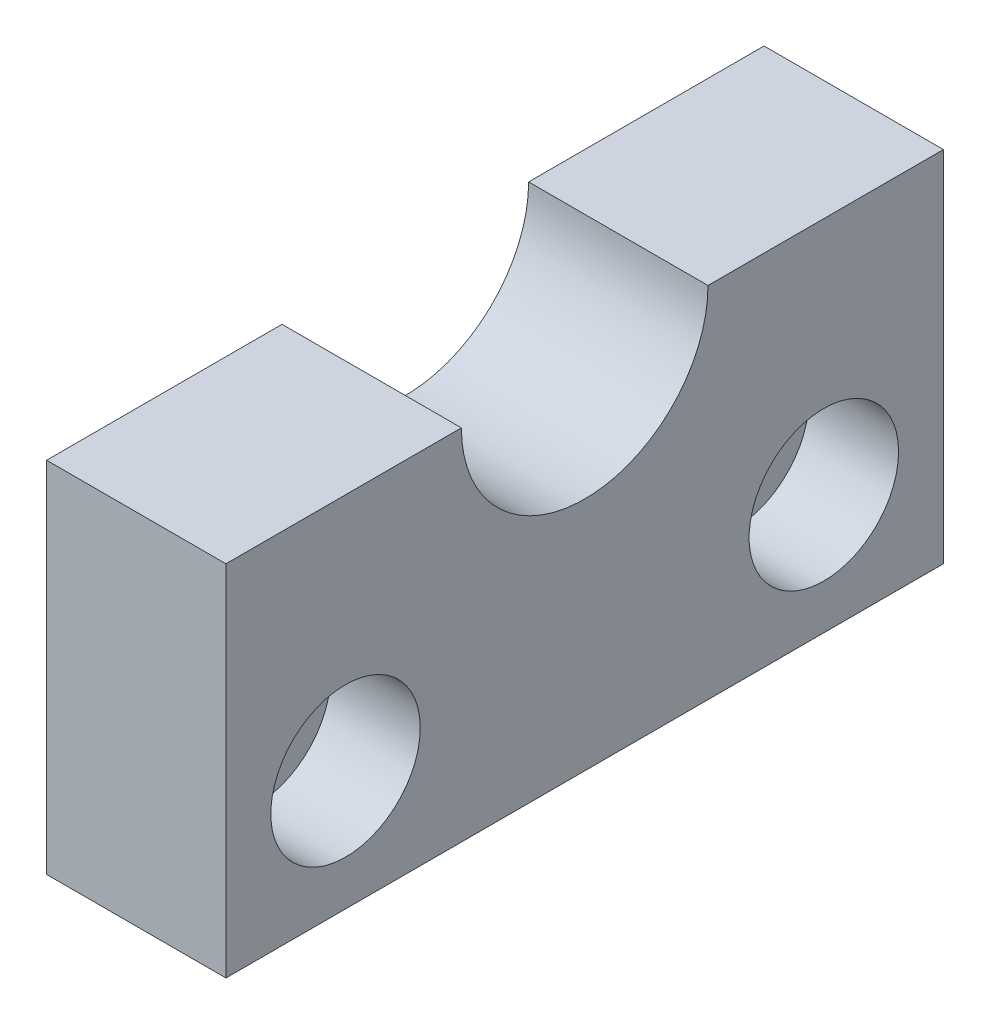
ISO-10303-21;
HEADER;
FILE_DESCRIPTION(('STEP AP214'),'2;1');
FILE_NAME('part.step','',(''),(''),'','','');
FILE_SCHEMA(('AUTOMOTIVE_DESIGN { 1 0 10303 214 1 1 1 1 }'));
ENDSEC;
DATA;
#1=APPLICATION_CONTEXT('core data for automotive mechanical design processes');
#2=APPLICATION_PROTOCOL_DEFINITION('international standard','automotive_design',2000,#1);
#3=PRODUCT_CONTEXT('',#1,'mechanical');
#4=PRODUCT('Part','Part','',(#3));
#5=PRODUCT_RELATED_PRODUCT_CATEGORY('part','',(#4));
#6=PRODUCT_DEFINITION_FORMATION('','',#4);
#7=PRODUCT_DEFINITION_CONTEXT('part definition',#1,'design');
#8=PRODUCT_DEFINITION('design','',#6,#7);
#9=PRODUCT_DEFINITION_SHAPE('','',#8);
#10=(LENGTH_UNIT() NAMED_UNIT(*) SI_UNIT(.MILLI.,.METRE.));
#11=(NAMED_UNIT(*) PLANE_ANGLE_UNIT() SI_UNIT($,.RADIAN.));
#12=(NAMED_UNIT(*) SI_UNIT($,.STERADIAN.) SOLID_ANGLE_UNIT());
#13=UNCERTAINTY_MEASURE_WITH_UNIT(LENGTH_MEASURE(1.E-05),#10,'distance_accuracy_value','');
#14=(GEOMETRIC_REPRESENTATION_CONTEXT(3) GLOBAL_UNCERTAINTY_ASSIGNED_CONTEXT((#13)) GLOBAL_UNIT_ASSIGNED_CONTEXT((#10,
#11,#12)) REPRESENTATION_CONTEXT('',''));
#15=CARTESIAN_POINT('',(0.,0.,0.));
#16=DIRECTION('',(0.,0.,1.));
#17=DIRECTION('',(1.,0.,0.));
#18=AXIS2_PLACEMENT_3D('',#15,#16,#17);
#19=CARTESIAN_POINT('',(19.05,0.,0.));
#20=DIRECTION('',(0.,0.,-1.));
#21=DIRECTION('',(-1.,0.,0.));
#22=AXIS2_PLACEMENT_3D('',#19,#20,#21);
#23=PLANE('',#22);
#24=DIRECTION('',(0.,-1.,0.));
#25=VECTOR('',#24,1.);
#26=CARTESIAN_POINT('',(19.05,0.,0.));
#27=LINE('',#26,#25);
#28=CARTESIAN_POINT('',(19.05,38.1,0.));
#29=VERTEX_POINT('',#28);
#30=CARTESIAN_POINT('',(19.05,0.,0.));
#31=VERTEX_POINT('',#30);
#32=EDGE_CURVE('E102',#29,#31,#27,.T.);
#33=ORIENTED_EDGE('',*,*,#32,.F.);
#34=DIRECTION('',(1.,0.,0.));
#35=VECTOR('',#34,1.);
#36=CARTESIAN_POINT('',(0.,38.1,0.));
#37=LINE('',#36,#35);
#38=CARTESIAN_POINT('',(0.,38.1,0.));
#39=VERTEX_POINT('',#38);
#40=EDGE_CURVE('E91',#39,#29,#37,.T.);
#41=ORIENTED_EDGE('',*,*,#40,.F.);
#42=DIRECTION('',(0.,-1.,0.));
#43=VECTOR('',#42,1.);
#44=CARTESIAN_POINT('',(0.,0.,0.));
#45=LINE('',#44,#43);
#46=CARTESIAN_POINT('',(0.,0.,0.));
#47=VERTEX_POINT('',#46);
#48=EDGE_CURVE('E100',#39,#47,#45,.T.);
#49=ORIENTED_EDGE('',*,*,#48,.T.);
#50=DIRECTION('',(-1.,0.,0.));
#51=VECTOR('',#50,1.);
#52=CARTESIAN_POINT('',(19.05,0.,0.));
#53=LINE('',#52,#51);
#54=EDGE_CURVE('E125',#31,#47,#53,.T.);
#55=ORIENTED_EDGE('',*,*,#54,.F.);
#56=EDGE_LOOP('',(#33,#41,#49,#55));
#57=FACE_BOUND('',#56,.T.);
#58=ADVANCED_FACE('F39',(#57),#23,.F.);
#59=CARTESIAN_POINT('',(19.05,0.,0.));
#60=DIRECTION('',(0.,1.,0.));
#61=DIRECTION('',(0.,0.,1.));
#62=AXIS2_PLACEMENT_3D('',#59,#60,#61);
#63=PLANE('',#62);
#64=DIRECTION('',(0.,0.,-1.));
#65=VECTOR('',#64,1.);
#66=CARTESIAN_POINT('',(0.,0.,0.));
#67=LINE('',#66,#65);
#68=CARTESIAN_POINT('',(0.,0.,-76.2));
#69=VERTEX_POINT('',#68);
#70=EDGE_CURVE('E108',#47,#69,#67,.T.);
#71=ORIENTED_EDGE('',*,*,#70,.T.);
#72=DIRECTION('',(-1.,0.,0.));
#73=VECTOR('',#72,1.);
#74=CARTESIAN_POINT('',(19.05,0.,-76.2));
#75=LINE('',#74,#73);
#76=CARTESIAN_POINT('',(19.05,0.,-76.2));
#77=VERTEX_POINT('',#76);
#78=EDGE_CURVE('E122',#77,#69,#75,.T.);
#79=ORIENTED_EDGE('',*,*,#78,.F.);
#80=DIRECTION('',(0.,0.,-1.));
#81=VECTOR('',#80,1.);
#82=CARTESIAN_POINT('',(19.05,0.,0.));
#83=LINE('',#82,#81);
#84=EDGE_CURVE('E141',#31,#77,#83,.T.);
#85=ORIENTED_EDGE('',*,*,#84,.F.);
#86=ORIENTED_EDGE('',*,*,#54,.T.);
#87=EDGE_LOOP('',(#71,#79,#85,#86));
#88=FACE_BOUND('',#87,.T.);
#89=ADVANCED_FACE('F195',(#88),#63,.F.);
#90=CARTESIAN_POINT('',(19.05,0.,-76.2));
#91=DIRECTION('',(0.,0.,1.));
#92=DIRECTION('',(1.,0.,0.));
#93=AXIS2_PLACEMENT_3D('',#90,#91,#92);
#94=PLANE('',#93);
#95=DIRECTION('',(0.,1.,0.));
#96=VECTOR('',#95,1.);
#97=CARTESIAN_POINT('',(0.,0.,-76.2));
#98=LINE('',#97,#96);
#99=CARTESIAN_POINT('',(0.,38.1,-76.2));
#100=VERTEX_POINT('',#99);
#101=EDGE_CURVE('E112',#69,#100,#98,.T.);
#102=ORIENTED_EDGE('',*,*,#101,.T.);
#103=DIRECTION('',(1.,0.,0.));
#104=VECTOR('',#103,1.);
#105=CARTESIAN_POINT('',(0.,38.1,-76.2));
#106=LINE('',#105,#104);
#107=CARTESIAN_POINT('',(19.05,38.1,-76.2));
#108=VERTEX_POINT('',#107);
#109=EDGE_CURVE('E103',#100,#108,#106,.T.);
#110=ORIENTED_EDGE('',*,*,#109,.T.);
#111=DIRECTION('',(0.,1.,0.));
#112=VECTOR('',#111,1.);
#113=CARTESIAN_POINT('',(19.05,0.,-76.2));
#114=LINE('',#113,#112);
#115=EDGE_CURVE('E117',#77,#108,#114,.T.);
#116=ORIENTED_EDGE('',*,*,#115,.F.);
#117=ORIENTED_EDGE('',*,*,#78,.T.);
#118=EDGE_LOOP('',(#102,#110,#116,#117));
#119=FACE_BOUND('',#118,.T.);
#120=ADVANCED_FACE('F147',(#119),#94,.F.);
#121=CARTESIAN_POINT('',(19.05,0.,0.));
#122=DIRECTION('',(-1.,0.,0.));
#123=DIRECTION('',(0.,0.,1.));
#124=AXIS2_PLACEMENT_3D('',#121,#122,#123);
#125=PLANE('',#124);
#126=CARTESIAN_POINT('',(19.05,12.7,-12.7));
#127=DIRECTION('',(1.,0.,0.));
#128=DIRECTION('',(0.,0.,-1.));
#129=AXIS2_PLACEMENT_3D('',#126,#127,#128);
#130=CIRCLE('',#129,7.9375);
#131=CARTESIAN_POINT('',(19.05,12.7,-20.6375));
#132=VERTEX_POINT('',#131);
#133=EDGE_CURVE('E148',#132,#132,#130,.T.);
#134=ORIENTED_EDGE('',*,*,#133,.F.);
#135=EDGE_LOOP('',(#134));
#136=FACE_BOUND('',#135,.T.);
#137=CARTESIAN_POINT('',(19.05,12.7,-63.5));
#138=DIRECTION('',(1.,0.,0.));
#139=DIRECTION('',(0.,0.,-1.));
#140=AXIS2_PLACEMENT_3D('',#137,#138,#139);
#141=CIRCLE('',#140,7.9375);
#142=CARTESIAN_POINT('',(19.05,12.7,-71.4375));
#143=VERTEX_POINT('',#142);
#144=EDGE_CURVE('E163',#143,#143,#141,.T.);
#145=ORIENTED_EDGE('',*,*,#144,.F.);
#146=EDGE_LOOP('',(#145));
#147=FACE_BOUND('',#146,.T.);
#148=ORIENTED_EDGE('',*,*,#115,.T.);
#149=DIRECTION('',(0.,0.,-1.));
#150=VECTOR('',#149,1.);
#151=CARTESIAN_POINT('',(19.05,38.1,0.));
#152=LINE('',#151,#150);
#153=CARTESIAN_POINT('',(19.05,38.1,-51.196875));
#154=VERTEX_POINT('',#153);
#155=EDGE_CURVE('E134',#154,#108,#152,.T.);
#156=ORIENTED_EDGE('',*,*,#155,.F.);
#157=CARTESIAN_POINT('',(19.05,38.1,-38.1));
#158=DIRECTION('',(1.,0.,0.));
#159=DIRECTION('',(0.,0.,-1.));
#160=AXIS2_PLACEMENT_3D('',#157,#158,#159);
#161=CIRCLE('',#160,13.096875);
#162=CARTESIAN_POINT('',(19.05,38.1,-25.003125));
#163=VERTEX_POINT('',#162);
#164=EDGE_CURVE('E114',#163,#154,#161,.T.);
#165=ORIENTED_EDGE('',*,*,#164,.F.);
#166=EDGE_CURVE('E53',#29,#163,#152,.T.);
#167=ORIENTED_EDGE('',*,*,#166,.F.);
#168=ORIENTED_EDGE('',*,*,#32,.T.);
#169=ORIENTED_EDGE('',*,*,#84,.T.);
#170=EDGE_LOOP('',(#148,#156,#165,#167,#168,#169));
#171=FACE_BOUND('',#170,.T.);
#172=ADVANCED_FACE('F133',(#136,#147,#171),#125,.F.);
#173=CARTESIAN_POINT('',(0.,0.,0.));
#174=DIRECTION('',(-1.,0.,0.));
#175=DIRECTION('',(0.,0.,1.));
#176=AXIS2_PLACEMENT_3D('',#173,#174,#175);
#177=PLANE('',#176);
#178=DIRECTION('',(0.,0.,-1.));
#179=VECTOR('',#178,1.);
#180=CARTESIAN_POINT('',(0.,38.1,0.));
#181=LINE('',#180,#179);
#182=CARTESIAN_POINT('',(0.,38.1,-51.196875));
#183=VERTEX_POINT('',#182);
#184=EDGE_CURVE('E61',#183,#100,#181,.T.);
#185=ORIENTED_EDGE('',*,*,#184,.T.);
#186=ORIENTED_EDGE('',*,*,#101,.F.);
#187=ORIENTED_EDGE('',*,*,#70,.F.);
#188=ORIENTED_EDGE('',*,*,#48,.F.);
#189=CARTESIAN_POINT('',(0.,38.1,-25.003125));
#190=VERTEX_POINT('',#189);
#191=EDGE_CURVE('E88',#39,#190,#181,.T.);
#192=ORIENTED_EDGE('',*,*,#191,.T.);
#193=CARTESIAN_POINT('',(0.,38.1,-38.1));
#194=DIRECTION('',(1.,0.,0.));
#195=DIRECTION('',(0.,0.,-1.));
#196=AXIS2_PLACEMENT_3D('',#193,#194,#195);
#197=CIRCLE('',#196,13.096875);
#198=EDGE_CURVE('E110',#190,#183,#197,.T.);
#199=ORIENTED_EDGE('',*,*,#198,.T.);
#200=EDGE_LOOP('',(#185,#186,#187,#188,#192,#199));
#201=FACE_BOUND('',#200,.T.);
#202=CARTESIAN_POINT('',(0.,12.7,-12.7));
#203=DIRECTION('',(1.,0.,0.));
#204=DIRECTION('',(0.,0.,-1.));
#205=AXIS2_PLACEMENT_3D('',#202,#203,#204);
#206=CIRCLE('',#205,4.9022);
#207=CARTESIAN_POINT('',(0.,12.7,-17.6022));
#208=VERTEX_POINT('',#207);
#209=EDGE_CURVE('E160',#208,#208,#206,.T.);
#210=ORIENTED_EDGE('',*,*,#209,.T.);
#211=EDGE_LOOP('',(#210));
#212=FACE_BOUND('',#211,.T.);
#213=CARTESIAN_POINT('',(0.,12.7,-63.5));
#214=DIRECTION('',(1.,0.,0.));
#215=DIRECTION('',(0.,0.,-1.));
#216=AXIS2_PLACEMENT_3D('',#213,#214,#215);
#217=CIRCLE('',#216,4.9022);
#218=CARTESIAN_POINT('',(0.,12.7,-68.4022));
#219=VERTEX_POINT('',#218);
#220=EDGE_CURVE('E135',#219,#219,#217,.T.);
#221=ORIENTED_EDGE('',*,*,#220,.T.);
#222=EDGE_LOOP('',(#221));
#223=FACE_BOUND('',#222,.T.);
#224=ADVANCED_FACE('F105',(#201,#212,#223),#177,.T.);
#225=CARTESIAN_POINT('',(0.,38.1,-38.1));
#226=DIRECTION('',(1.,0.,0.));
#227=DIRECTION('',(0.,0.,-1.));
#228=AXIS2_PLACEMENT_3D('',#225,#226,#227);
#229=CYLINDRICAL_SURFACE('',#228,13.096875);
#230=ORIENTED_EDGE('',*,*,#164,.T.);
#231=DIRECTION('',(1.,0.,0.));
#232=VECTOR('',#231,1.);
#233=CARTESIAN_POINT('',(0.,38.1,-51.196875));
#234=LINE('',#233,#232);
#235=EDGE_CURVE('E11',#154,#183,#234,.F.);
#236=ORIENTED_EDGE('',*,*,#235,.T.);
#237=ORIENTED_EDGE('',*,*,#198,.F.);
#238=DIRECTION('',(1.,0.,0.));
#239=VECTOR('',#238,1.);
#240=CARTESIAN_POINT('',(0.,38.1,-25.003125));
#241=LINE('',#240,#239);
#242=EDGE_CURVE('E46',#190,#163,#241,.T.);
#243=ORIENTED_EDGE('',*,*,#242,.T.);
#244=EDGE_LOOP('',(#230,#236,#237,#243));
#245=FACE_BOUND('',#244,.T.);
#246=ADVANCED_FACE('F129',(#245),#229,.F.);
#247=CARTESIAN_POINT('',(19.05,12.7,-63.5));
#248=DIRECTION('',(1.,0.,0.));
#249=DIRECTION('',(0.,0.,-1.));
#250=AXIS2_PLACEMENT_3D('',#247,#248,#249);
#251=CYLINDRICAL_SURFACE('',#250,4.9022);
#252=ORIENTED_EDGE('',*,*,#220,.F.);
#253=EDGE_LOOP('',(#252));
#254=FACE_BOUND('',#253,.T.);
#255=CARTESIAN_POINT('',(9.525,12.7,-63.5));
#256=DIRECTION('',(1.,0.,0.));
#257=DIRECTION('',(0.,0.,-1.));
#258=AXIS2_PLACEMENT_3D('',#255,#256,#257);
#259=CIRCLE('',#258,4.9022);
#260=CARTESIAN_POINT('',(9.525,12.7,-68.4022));
#261=VERTEX_POINT('',#260);
#262=EDGE_CURVE('E138',#261,#261,#259,.T.);
#263=ORIENTED_EDGE('',*,*,#262,.T.);
#264=EDGE_LOOP('',(#263));
#265=FACE_BOUND('',#264,.T.);
#266=ADVANCED_FACE('F172',(#254,#265),#251,.F.);
#267=CARTESIAN_POINT('',(9.525,17.6022,-63.5));
#268=DIRECTION('',(-1.,0.,0.));
#269=DIRECTION('',(0.,0.,1.));
#270=AXIS2_PLACEMENT_3D('',#267,#268,#269);
#271=PLANE('',#270);
#272=ORIENTED_EDGE('',*,*,#262,.F.);
#273=EDGE_LOOP('',(#272));
#274=FACE_BOUND('',#273,.T.);
#275=CARTESIAN_POINT('',(9.525,12.7,-63.5));
#276=DIRECTION('',(1.,0.,0.));
#277=DIRECTION('',(0.,0.,-1.));
#278=AXIS2_PLACEMENT_3D('',#275,#276,#277);
#279=CIRCLE('',#278,7.9375);
#280=CARTESIAN_POINT('',(9.525,12.7,-71.4375));
#281=VERTEX_POINT('',#280);
#282=EDGE_CURVE('E166',#281,#281,#279,.T.);
#283=ORIENTED_EDGE('',*,*,#282,.T.);
#284=EDGE_LOOP('',(#283));
#285=FACE_BOUND('',#284,.T.);
#286=ADVANCED_FACE('F174',(#274,#285),#271,.F.);
#287=CARTESIAN_POINT('',(19.05,12.7,-63.5));
#288=DIRECTION('',(1.,0.,0.));
#289=DIRECTION('',(0.,0.,-1.));
#290=AXIS2_PLACEMENT_3D('',#287,#288,#289);
#291=CYLINDRICAL_SURFACE('',#290,7.9375);
#292=ORIENTED_EDGE('',*,*,#282,.F.);
#293=EDGE_LOOP('',(#292));
#294=FACE_BOUND('',#293,.T.);
#295=ORIENTED_EDGE('',*,*,#144,.T.);
#296=EDGE_LOOP('',(#295));
#297=FACE_BOUND('',#296,.T.);
#298=ADVANCED_FACE('F177',(#294,#297),#291,.F.);
#299=CARTESIAN_POINT('',(19.05,12.7,-12.7));
#300=DIRECTION('',(1.,0.,0.));
#301=DIRECTION('',(0.,0.,-1.));
#302=AXIS2_PLACEMENT_3D('',#299,#300,#301);
#303=CYLINDRICAL_SURFACE('',#302,4.9022);
#304=ORIENTED_EDGE('',*,*,#209,.F.);
#305=EDGE_LOOP('',(#304));
#306=FACE_BOUND('',#305,.T.);
#307=CARTESIAN_POINT('',(9.525,12.7,-12.7));
#308=DIRECTION('',(1.,0.,0.));
#309=DIRECTION('',(0.,0.,-1.));
#310=AXIS2_PLACEMENT_3D('',#307,#308,#309);
#311=CIRCLE('',#310,4.9022);
#312=CARTESIAN_POINT('',(9.525,12.7,-17.6022));
#313=VERTEX_POINT('',#312);
#314=EDGE_CURVE('E157',#313,#313,#311,.T.);
#315=ORIENTED_EDGE('',*,*,#314,.T.);
#316=EDGE_LOOP('',(#315));
#317=FACE_BOUND('',#316,.T.);
#318=ADVANCED_FACE('F183',(#306,#317),#303,.F.);
#319=CARTESIAN_POINT('',(9.525,17.6022,-12.7));
#320=DIRECTION('',(-1.,0.,0.));
#321=DIRECTION('',(0.,0.,1.));
#322=AXIS2_PLACEMENT_3D('',#319,#320,#321);
#323=PLANE('',#322);
#324=ORIENTED_EDGE('',*,*,#314,.F.);
#325=EDGE_LOOP('',(#324));
#326=FACE_BOUND('',#325,.T.);
#327=CARTESIAN_POINT('',(9.525,12.7,-12.7));
#328=DIRECTION('',(1.,0.,0.));
#329=DIRECTION('',(0.,0.,-1.));
#330=AXIS2_PLACEMENT_3D('',#327,#328,#329);
#331=CIRCLE('',#330,7.9375);
#332=CARTESIAN_POINT('',(9.525,12.7,-20.6375));
#333=VERTEX_POINT('',#332);
#334=EDGE_CURVE('E151',#333,#333,#331,.T.);
#335=ORIENTED_EDGE('',*,*,#334,.T.);
#336=EDGE_LOOP('',(#335));
#337=FACE_BOUND('',#336,.T.);
#338=ADVANCED_FACE('F230',(#326,#337),#323,.F.);
#339=CARTESIAN_POINT('',(19.05,12.7,-12.7));
#340=DIRECTION('',(1.,0.,0.));
#341=DIRECTION('',(0.,0.,-1.));
#342=AXIS2_PLACEMENT_3D('',#339,#340,#341);
#343=CYLINDRICAL_SURFACE('',#342,7.9375);
#344=ORIENTED_EDGE('',*,*,#334,.F.);
#345=EDGE_LOOP('',(#344));
#346=FACE_BOUND('',#345,.T.);
#347=ORIENTED_EDGE('',*,*,#133,.T.);
#348=EDGE_LOOP('',(#347));
#349=FACE_BOUND('',#348,.T.);
#350=ADVANCED_FACE('F237',(#346,#349),#343,.F.);
#351=CARTESIAN_POINT('',(0.,38.1,0.));
#352=DIRECTION('',(0.,-1.,0.));
#353=DIRECTION('',(0.,0.,-1.));
#354=AXIS2_PLACEMENT_3D('',#351,#352,#353);
#355=PLANE('',#354);
#356=ORIENTED_EDGE('',*,*,#191,.F.);
#357=ORIENTED_EDGE('',*,*,#40,.T.);
#358=ORIENTED_EDGE('',*,*,#166,.T.);
#359=ORIENTED_EDGE('',*,*,#242,.F.);
#360=EDGE_LOOP('',(#356,#357,#358,#359));
#361=FACE_BOUND('',#360,.T.);
#362=ADVANCED_FACE('F90',(#361),#355,.F.);
#363=ORIENTED_EDGE('',*,*,#155,.T.);
#364=ORIENTED_EDGE('',*,*,#109,.F.);
#365=ORIENTED_EDGE('',*,*,#184,.F.);
#366=ORIENTED_EDGE('',*,*,#235,.F.);
#367=EDGE_LOOP('',(#363,#364,#365,#366));
#368=FACE_BOUND('',#367,.T.);
#369=ADVANCED_FACE('F253',(#368),#355,.F.);
#370=CLOSED_SHELL('',(#58,#89,#120,#172,#224,#246,#266,#286,#298,#318,#338,#350,#362,#369));
#371=MANIFOLD_SOLID_BREP('B2',#370);
#372=ADVANCED_BREP_SHAPE_REPRESENTATION('',(#18,#371),#14);
#373=SHAPE_DEFINITION_REPRESENTATION(#9,#372);
ENDSEC;
END-ISO-10303-21;
